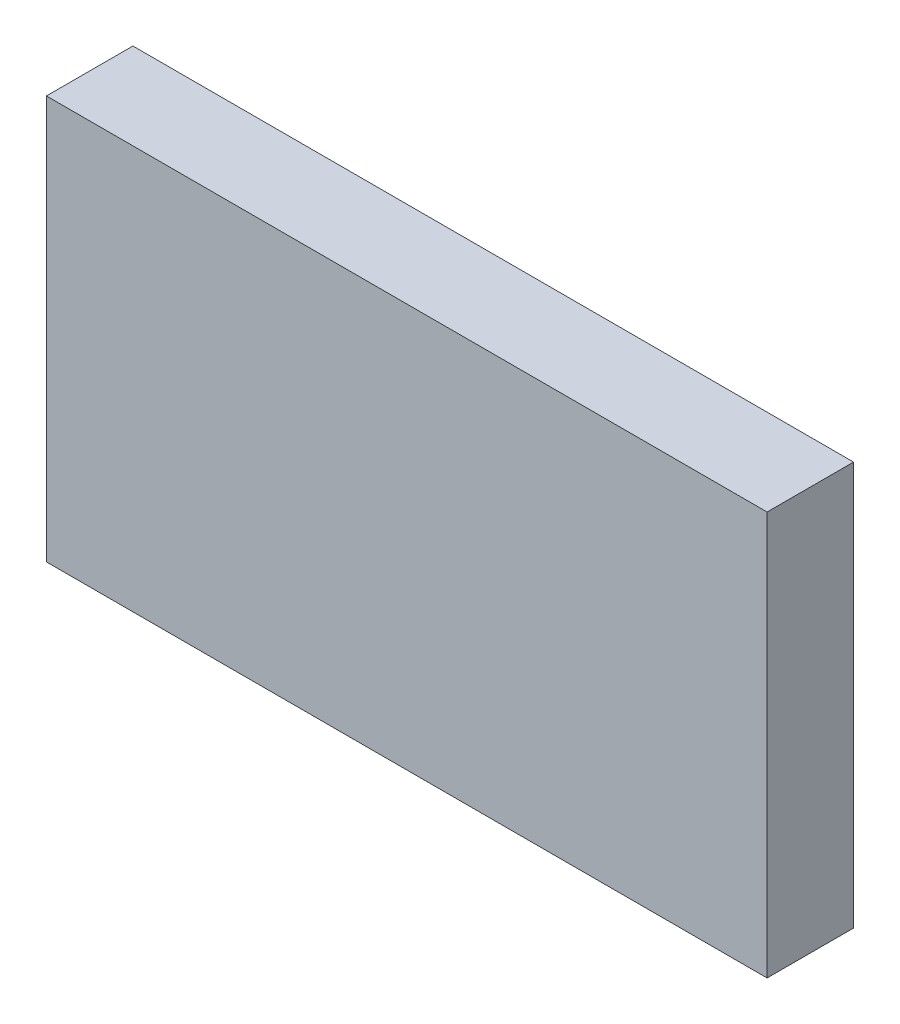
ISO-10303-21;
HEADER;
FILE_DESCRIPTION(('STEP AP214'),'2;1');
FILE_NAME('part.step','',(''),(''),'','','');
FILE_SCHEMA(('AUTOMOTIVE_DESIGN { 1 0 10303 214 1 1 1 1 }'));
ENDSEC;
DATA;
#1=APPLICATION_CONTEXT('core data for automotive mechanical design processes');
#2=APPLICATION_PROTOCOL_DEFINITION('international standard','automotive_design',2000,#1);
#3=PRODUCT_CONTEXT('',#1,'mechanical');
#4=PRODUCT('Part','Part','',(#3));
#5=PRODUCT_RELATED_PRODUCT_CATEGORY('part','',(#4));
#6=PRODUCT_DEFINITION_FORMATION('','',#4);
#7=PRODUCT_DEFINITION_CONTEXT('part definition',#1,'design');
#8=PRODUCT_DEFINITION('design','',#6,#7);
#9=PRODUCT_DEFINITION_SHAPE('','',#8);
#10=(LENGTH_UNIT() NAMED_UNIT(*) SI_UNIT(.MILLI.,.METRE.));
#11=(NAMED_UNIT(*) PLANE_ANGLE_UNIT() SI_UNIT($,.RADIAN.));
#12=(NAMED_UNIT(*) SI_UNIT($,.STERADIAN.) SOLID_ANGLE_UNIT());
#13=UNCERTAINTY_MEASURE_WITH_UNIT(LENGTH_MEASURE(1.E-05),#10,'distance_accuracy_value','');
#14=(GEOMETRIC_REPRESENTATION_CONTEXT(3) GLOBAL_UNCERTAINTY_ASSIGNED_CONTEXT((#13)) GLOBAL_UNIT_ASSIGNED_CONTEXT((#10,
#11,#12)) REPRESENTATION_CONTEXT('',''));
#15=CARTESIAN_POINT('',(0.,0.,0.));
#16=DIRECTION('',(0.,0.,1.));
#17=DIRECTION('',(1.,0.,0.));
#18=AXIS2_PLACEMENT_3D('',#15,#16,#17);
#19=CARTESIAN_POINT('',(0.,0.,19.05));
#20=DIRECTION('',(1.,0.,0.));
#21=DIRECTION('',(0.,1.,0.));
#22=AXIS2_PLACEMENT_3D('',#19,#20,#21);
#23=PLANE('',#22);
#24=DIRECTION('',(0.,-1.,0.));
#25=VECTOR('',#24,1.);
#26=CARTESIAN_POINT('',(0.,0.,0.));
#27=LINE('',#26,#25);
#28=CARTESIAN_POINT('',(0.,88.9,0.));
#29=VERTEX_POINT('',#28);
#30=CARTESIAN_POINT('',(0.,0.,0.));
#31=VERTEX_POINT('',#30);
#32=EDGE_CURVE('E107',#29,#31,#27,.T.);
#33=ORIENTED_EDGE('',*,*,#32,.T.);
#34=DIRECTION('',(0.,0.,-1.));
#35=VECTOR('',#34,1.);
#36=CARTESIAN_POINT('',(0.,0.,19.05));
#37=LINE('',#36,#35);
#38=CARTESIAN_POINT('',(0.,0.,19.05));
#39=VERTEX_POINT('',#38);
#40=EDGE_CURVE('E11',#39,#31,#37,.T.);
#41=ORIENTED_EDGE('',*,*,#40,.F.);
#42=DIRECTION('',(0.,-1.,0.));
#43=VECTOR('',#42,1.);
#44=CARTESIAN_POINT('',(0.,0.,19.05));
#45=LINE('',#44,#43);
#46=CARTESIAN_POINT('',(0.,88.9,19.05));
#47=VERTEX_POINT('',#46);
#48=EDGE_CURVE('E91',#47,#39,#45,.T.);
#49=ORIENTED_EDGE('',*,*,#48,.F.);
#50=DIRECTION('',(0.,0.,-1.));
#51=VECTOR('',#50,1.);
#52=CARTESIAN_POINT('',(0.,88.9,19.05));
#53=LINE('',#52,#51);
#54=EDGE_CURVE('E103',#47,#29,#53,.T.);
#55=ORIENTED_EDGE('',*,*,#54,.T.);
#56=EDGE_LOOP('',(#33,#41,#49,#55));
#57=FACE_BOUND('',#56,.T.);
#58=ADVANCED_FACE('F39',(#57),#23,.F.);
#59=CARTESIAN_POINT('',(0.,0.,19.05));
#60=DIRECTION('',(0.,1.,0.));
#61=DIRECTION('',(0.,0.,1.));
#62=AXIS2_PLACEMENT_3D('',#59,#60,#61);
#63=PLANE('',#62);
#64=DIRECTION('',(1.,0.,0.));
#65=VECTOR('',#64,1.);
#66=CARTESIAN_POINT('',(0.,0.,0.));
#67=LINE('',#66,#65);
#68=CARTESIAN_POINT('',(158.75,0.,0.));
#69=VERTEX_POINT('',#68);
#70=EDGE_CURVE('E96',#31,#69,#67,.T.);
#71=ORIENTED_EDGE('',*,*,#70,.T.);
#72=DIRECTION('',(0.,0.,-1.));
#73=VECTOR('',#72,1.);
#74=CARTESIAN_POINT('',(158.75,0.,19.05));
#75=LINE('',#74,#73);
#76=CARTESIAN_POINT('',(158.75,0.,19.05));
#77=VERTEX_POINT('',#76);
#78=EDGE_CURVE('E48',#77,#69,#75,.T.);
#79=ORIENTED_EDGE('',*,*,#78,.F.);
#80=DIRECTION('',(1.,0.,0.));
#81=VECTOR('',#80,1.);
#82=CARTESIAN_POINT('',(0.,0.,19.05));
#83=LINE('',#82,#81);
#84=EDGE_CURVE('E86',#39,#77,#83,.T.);
#85=ORIENTED_EDGE('',*,*,#84,.F.);
#86=ORIENTED_EDGE('',*,*,#40,.T.);
#87=EDGE_LOOP('',(#71,#79,#85,#86));
#88=FACE_BOUND('',#87,.T.);
#89=ADVANCED_FACE('F95',(#88),#63,.F.);
#90=CARTESIAN_POINT('',(158.75,0.,19.05));
#91=DIRECTION('',(-1.,0.,0.));
#92=DIRECTION('',(0.,-1.,0.));
#93=AXIS2_PLACEMENT_3D('',#90,#91,#92);
#94=PLANE('',#93);
#95=DIRECTION('',(0.,1.,0.));
#96=VECTOR('',#95,1.);
#97=CARTESIAN_POINT('',(158.75,0.,0.));
#98=LINE('',#97,#96);
#99=CARTESIAN_POINT('',(158.75,88.9,0.));
#100=VERTEX_POINT('',#99);
#101=EDGE_CURVE('E73',#69,#100,#98,.T.);
#102=ORIENTED_EDGE('',*,*,#101,.T.);
#103=DIRECTION('',(0.,0.,-1.));
#104=VECTOR('',#103,1.);
#105=CARTESIAN_POINT('',(158.75,88.9,19.05));
#106=LINE('',#105,#104);
#107=CARTESIAN_POINT('',(158.75,88.9,19.05));
#108=VERTEX_POINT('',#107);
#109=EDGE_CURVE('E98',#108,#100,#106,.T.);
#110=ORIENTED_EDGE('',*,*,#109,.F.);
#111=DIRECTION('',(0.,1.,0.));
#112=VECTOR('',#111,1.);
#113=CARTESIAN_POINT('',(158.75,0.,19.05));
#114=LINE('',#113,#112);
#115=EDGE_CURVE('E89',#77,#108,#114,.T.);
#116=ORIENTED_EDGE('',*,*,#115,.F.);
#117=ORIENTED_EDGE('',*,*,#78,.T.);
#118=EDGE_LOOP('',(#102,#110,#116,#117));
#119=FACE_BOUND('',#118,.T.);
#120=ADVANCED_FACE('F99',(#119),#94,.F.);
#121=CARTESIAN_POINT('',(0.,88.9,19.05));
#122=DIRECTION('',(0.,-1.,0.));
#123=DIRECTION('',(0.,0.,-1.));
#124=AXIS2_PLACEMENT_3D('',#121,#122,#123);
#125=PLANE('',#124);
#126=DIRECTION('',(-1.,0.,0.));
#127=VECTOR('',#126,1.);
#128=CARTESIAN_POINT('',(0.,88.9,0.));
#129=LINE('',#128,#127);
#130=EDGE_CURVE('E79',#100,#29,#129,.T.);
#131=ORIENTED_EDGE('',*,*,#130,.T.);
#132=ORIENTED_EDGE('',*,*,#54,.F.);
#133=DIRECTION('',(-1.,0.,0.));
#134=VECTOR('',#133,1.);
#135=CARTESIAN_POINT('',(0.,88.9,19.05));
#136=LINE('',#135,#134);
#137=EDGE_CURVE('E56',#108,#47,#136,.T.);
#138=ORIENTED_EDGE('',*,*,#137,.F.);
#139=ORIENTED_EDGE('',*,*,#109,.T.);
#140=EDGE_LOOP('',(#131,#132,#138,#139));
#141=FACE_BOUND('',#140,.T.);
#142=ADVANCED_FACE('F120',(#141),#125,.F.);
#143=CARTESIAN_POINT('',(0.,0.,19.05));
#144=DIRECTION('',(0.,0.,-1.));
#145=DIRECTION('',(-1.,0.,0.));
#146=AXIS2_PLACEMENT_3D('',#143,#144,#145);
#147=PLANE('',#146);
#148=ORIENTED_EDGE('',*,*,#48,.T.);
#149=ORIENTED_EDGE('',*,*,#84,.T.);
#150=ORIENTED_EDGE('',*,*,#115,.T.);
#151=ORIENTED_EDGE('',*,*,#137,.T.);
#152=EDGE_LOOP('',(#148,#149,#150,#151));
#153=FACE_BOUND('',#152,.T.);
#154=ADVANCED_FACE('F87',(#153),#147,.F.);
#155=CARTESIAN_POINT('',(0.,0.,0.));
#156=DIRECTION('',(0.,0.,-1.));
#157=DIRECTION('',(-1.,0.,0.));
#158=AXIS2_PLACEMENT_3D('',#155,#156,#157);
#159=PLANE('',#158);
#160=ORIENTED_EDGE('',*,*,#32,.F.);
#161=ORIENTED_EDGE('',*,*,#130,.F.);
#162=ORIENTED_EDGE('',*,*,#101,.F.);
#163=ORIENTED_EDGE('',*,*,#70,.F.);
#164=EDGE_LOOP('',(#160,#161,#162,#163));
#165=FACE_BOUND('',#164,.T.);
#166=ADVANCED_FACE('F123',(#165),#159,.T.);
#167=CLOSED_SHELL('',(#58,#89,#120,#142,#154,#166));
#168=MANIFOLD_SOLID_BREP('B2',#167);
#169=ADVANCED_BREP_SHAPE_REPRESENTATION('',(#18,#168),#14);
#170=SHAPE_DEFINITION_REPRESENTATION(#9,#169);
ENDSEC;
END-ISO-10303-21;
